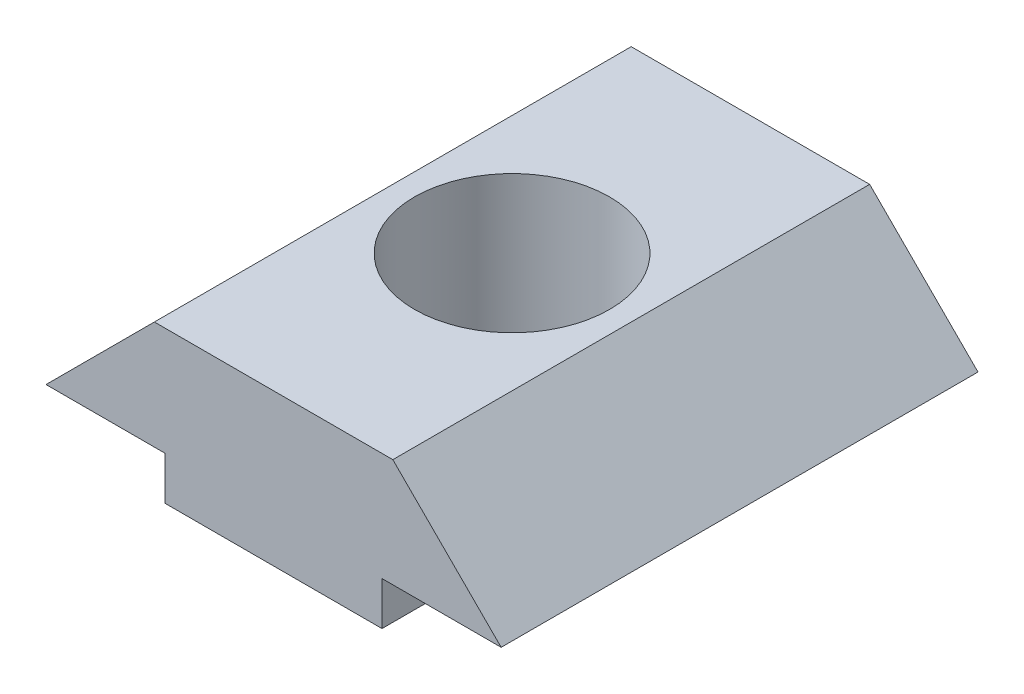
ISO-10303-21;
HEADER;
FILE_DESCRIPTION(('STEP AP214'),'2;1');
FILE_NAME('part.step','',(''),(''),'','','');
FILE_SCHEMA(('AUTOMOTIVE_DESIGN { 1 0 10303 214 1 1 1 1 }'));
ENDSEC;
DATA;
#1=APPLICATION_CONTEXT('core data for automotive mechanical design processes');
#2=APPLICATION_PROTOCOL_DEFINITION('international standard','automotive_design',2000,#1);
#3=PRODUCT_CONTEXT('',#1,'mechanical');
#4=PRODUCT('Part','Part','',(#3));
#5=PRODUCT_RELATED_PRODUCT_CATEGORY('part','',(#4));
#6=PRODUCT_DEFINITION_FORMATION('','',#4);
#7=PRODUCT_DEFINITION_CONTEXT('part definition',#1,'design');
#8=PRODUCT_DEFINITION('design','',#6,#7);
#9=PRODUCT_DEFINITION_SHAPE('','',#8);
#10=(LENGTH_UNIT() NAMED_UNIT(*) SI_UNIT(.MILLI.,.METRE.));
#11=(NAMED_UNIT(*) PLANE_ANGLE_UNIT() SI_UNIT($,.RADIAN.));
#12=(NAMED_UNIT(*) SI_UNIT($,.STERADIAN.) SOLID_ANGLE_UNIT());
#13=UNCERTAINTY_MEASURE_WITH_UNIT(LENGTH_MEASURE(1.E-05),#10,'distance_accuracy_value','');
#14=(GEOMETRIC_REPRESENTATION_CONTEXT(3) GLOBAL_UNCERTAINTY_ASSIGNED_CONTEXT((#13)) GLOBAL_UNIT_ASSIGNED_CONTEXT((#10,
#11,#12)) REPRESENTATION_CONTEXT('',''));
#15=CARTESIAN_POINT('',(0.,0.,0.));
#16=DIRECTION('',(0.,0.,1.));
#17=DIRECTION('',(1.,0.,0.));
#18=AXIS2_PLACEMENT_3D('',#15,#16,#17);
#19=CARTESIAN_POINT('',(0.,4.75,11.));
#20=DIRECTION('',(0.,-1.,0.));
#21=DIRECTION('',(0.,0.,-1.));
#22=AXIS2_PLACEMENT_3D('',#19,#20,#21);
#23=PLANE('',#22);
#24=CARTESIAN_POINT('',(0.000951887839418207,4.75,5.5));
#25=DIRECTION('',(0.,-1.,0.));
#26=DIRECTION('',(0.,0.,-1.));
#27=AXIS2_PLACEMENT_3D('',#24,#25,#26);
#28=CIRCLE('',#27,2.25);
#29=CARTESIAN_POINT('',(0.000951887839418207,4.75,3.25));
#30=VERTEX_POINT('',#29);
#31=EDGE_CURVE('E135',#30,#30,#28,.T.);
#32=ORIENTED_EDGE('',*,*,#31,.T.);
#33=EDGE_LOOP('',(#32));
#34=FACE_BOUND('',#33,.T.);
#35=DIRECTION('',(-1.,0.,0.));
#36=VECTOR('',#35,1.);
#37=CARTESIAN_POINT('',(0.,4.75,0.));
#38=LINE('',#37,#36);
#39=CARTESIAN_POINT('',(2.75095188783942,4.75,0.));
#40=VERTEX_POINT('',#39);
#41=CARTESIAN_POINT('',(-2.75,4.75,0.));
#42=VERTEX_POINT('',#41);
#43=EDGE_CURVE('E132',#40,#42,#38,.T.);
#44=ORIENTED_EDGE('',*,*,#43,.T.);
#45=DIRECTION('',(0.,0.,-1.));
#46=VECTOR('',#45,1.);
#47=CARTESIAN_POINT('',(-2.75,4.75,11.));
#48=LINE('',#47,#46);
#49=CARTESIAN_POINT('',(-2.75,4.75,11.));
#50=VERTEX_POINT('',#49);
#51=EDGE_CURVE('E11',#50,#42,#48,.T.);
#52=ORIENTED_EDGE('',*,*,#51,.F.);
#53=DIRECTION('',(-1.,0.,0.));
#54=VECTOR('',#53,1.);
#55=CARTESIAN_POINT('',(0.,4.75,11.));
#56=LINE('',#55,#54);
#57=CARTESIAN_POINT('',(2.75095188783942,4.75,11.));
#58=VERTEX_POINT('',#57);
#59=EDGE_CURVE('E153',#58,#50,#56,.T.);
#60=ORIENTED_EDGE('',*,*,#59,.F.);
#61=DIRECTION('',(0.,0.,-1.));
#62=VECTOR('',#61,1.);
#63=CARTESIAN_POINT('',(2.75095188783942,4.75,11.));
#64=LINE('',#63,#62);
#65=EDGE_CURVE('E50',#58,#40,#64,.T.);
#66=ORIENTED_EDGE('',*,*,#65,.T.);
#67=EDGE_LOOP('',(#44,#52,#60,#66));
#68=FACE_BOUND('',#67,.T.);
#69=ADVANCED_FACE('F34',(#34,#68),#23,.F.);
#70=CARTESIAN_POINT('',(-3.75,3.75,11.));
#71=DIRECTION('',(0.707106781186548,-0.707106781186548,0.));
#72=DIRECTION('',(0.707106781186548,0.707106781186548,0.));
#73=AXIS2_PLACEMENT_3D('',#70,#71,#72);
#74=PLANE('',#73);
#75=DIRECTION('',(-0.707106781186548,-0.707106781186548,0.));
#76=VECTOR('',#75,1.);
#77=CARTESIAN_POINT('',(-3.75,3.75,0.));
#78=LINE('',#77,#76);
#79=CARTESIAN_POINT('',(-5.25,2.25,0.));
#80=VERTEX_POINT('',#79);
#81=EDGE_CURVE('E134',#42,#80,#78,.T.);
#82=ORIENTED_EDGE('',*,*,#81,.T.);
#83=DIRECTION('',(0.,0.,-1.));
#84=VECTOR('',#83,1.);
#85=CARTESIAN_POINT('',(-5.25,2.25,11.));
#86=LINE('',#85,#84);
#87=CARTESIAN_POINT('',(-5.25,2.25,11.));
#88=VERTEX_POINT('',#87);
#89=EDGE_CURVE('E42',#88,#80,#86,.T.);
#90=ORIENTED_EDGE('',*,*,#89,.F.);
#91=DIRECTION('',(-0.707106781186548,-0.707106781186548,0.));
#92=VECTOR('',#91,1.);
#93=CARTESIAN_POINT('',(-3.75,3.75,11.));
#94=LINE('',#93,#92);
#95=EDGE_CURVE('E89',#50,#88,#94,.T.);
#96=ORIENTED_EDGE('',*,*,#95,.F.);
#97=ORIENTED_EDGE('',*,*,#51,.T.);
#98=EDGE_LOOP('',(#82,#90,#96,#97));
#99=FACE_BOUND('',#98,.T.);
#100=ADVANCED_FACE('F166',(#99),#74,.F.);
#101=CARTESIAN_POINT('',(0.,2.25,11.));
#102=DIRECTION('',(0.,-1.,0.));
#103=DIRECTION('',(0.,0.,-1.));
#104=AXIS2_PLACEMENT_3D('',#101,#102,#103);
#105=PLANE('',#104);
#106=DIRECTION('',(-1.,0.,0.));
#107=VECTOR('',#106,1.);
#108=CARTESIAN_POINT('',(0.,2.25,0.));
#109=LINE('',#108,#107);
#110=CARTESIAN_POINT('',(-2.5,2.25,0.));
#111=VERTEX_POINT('',#110);
#112=EDGE_CURVE('E138',#111,#80,#109,.T.);
#113=ORIENTED_EDGE('',*,*,#112,.F.);
#114=DIRECTION('',(0.,0.,-1.));
#115=VECTOR('',#114,1.);
#116=CARTESIAN_POINT('',(-2.5,2.25,11.));
#117=LINE('',#116,#115);
#118=CARTESIAN_POINT('',(-2.5,2.25,11.));
#119=VERTEX_POINT('',#118);
#120=EDGE_CURVE('E159',#119,#111,#117,.T.);
#121=ORIENTED_EDGE('',*,*,#120,.F.);
#122=DIRECTION('',(-1.,0.,0.));
#123=VECTOR('',#122,1.);
#124=CARTESIAN_POINT('',(0.,2.25,11.));
#125=LINE('',#124,#123);
#126=EDGE_CURVE('E165',#119,#88,#125,.T.);
#127=ORIENTED_EDGE('',*,*,#126,.T.);
#128=ORIENTED_EDGE('',*,*,#89,.T.);
#129=EDGE_LOOP('',(#113,#121,#127,#128));
#130=FACE_BOUND('',#129,.T.);
#131=ADVANCED_FACE('F163',(#130),#105,.T.);
#132=CARTESIAN_POINT('',(-2.5,0.,11.));
#133=DIRECTION('',(1.,0.,0.));
#134=DIRECTION('',(0.,1.,0.));
#135=AXIS2_PLACEMENT_3D('',#132,#133,#134);
#136=PLANE('',#135);
#137=DIRECTION('',(0.,-1.,0.));
#138=VECTOR('',#137,1.);
#139=CARTESIAN_POINT('',(-2.5,0.,0.));
#140=LINE('',#139,#138);
#141=CARTESIAN_POINT('',(-2.5,1.25,0.));
#142=VERTEX_POINT('',#141);
#143=EDGE_CURVE('E141',#111,#142,#140,.T.);
#144=ORIENTED_EDGE('',*,*,#143,.T.);
#145=DIRECTION('',(0.,0.,-1.));
#146=VECTOR('',#145,1.);
#147=CARTESIAN_POINT('',(-2.5,1.25,11.));
#148=LINE('',#147,#146);
#149=CARTESIAN_POINT('',(-2.5,1.25,11.));
#150=VERTEX_POINT('',#149);
#151=EDGE_CURVE('E157',#150,#142,#148,.T.);
#152=ORIENTED_EDGE('',*,*,#151,.F.);
#153=DIRECTION('',(0.,-1.,0.));
#154=VECTOR('',#153,1.);
#155=CARTESIAN_POINT('',(-2.5,0.,11.));
#156=LINE('',#155,#154);
#157=EDGE_CURVE('E127',#119,#150,#156,.T.);
#158=ORIENTED_EDGE('',*,*,#157,.F.);
#159=ORIENTED_EDGE('',*,*,#120,.T.);
#160=EDGE_LOOP('',(#144,#152,#158,#159));
#161=FACE_BOUND('',#160,.T.);
#162=ADVANCED_FACE('F174',(#161),#136,.F.);
#163=CARTESIAN_POINT('',(0.,1.25,11.));
#164=DIRECTION('',(0.,-1.,0.));
#165=DIRECTION('',(0.,0.,-1.));
#166=AXIS2_PLACEMENT_3D('',#163,#164,#165);
#167=PLANE('',#166);
#168=CARTESIAN_POINT('',(0.000951887839418207,1.25,5.5));
#169=DIRECTION('',(0.,-1.,0.));
#170=DIRECTION('',(0.,0.,-1.));
#171=AXIS2_PLACEMENT_3D('',#168,#169,#170);
#172=CIRCLE('',#171,2.25);
#173=CARTESIAN_POINT('',(0.000951887839418207,1.25,3.25));
#174=VERTEX_POINT('',#173);
#175=EDGE_CURVE('E180',#174,#174,#172,.T.);
#176=ORIENTED_EDGE('',*,*,#175,.F.);
#177=EDGE_LOOP('',(#176));
#178=FACE_BOUND('',#177,.T.);
#179=DIRECTION('',(-1.,0.,0.));
#180=VECTOR('',#179,1.);
#181=CARTESIAN_POINT('',(0.,1.25,0.));
#182=LINE('',#181,#180);
#183=CARTESIAN_POINT('',(2.50095188783942,1.25,0.));
#184=VERTEX_POINT('',#183);
#185=EDGE_CURVE('E144',#184,#142,#182,.T.);
#186=ORIENTED_EDGE('',*,*,#185,.F.);
#187=DIRECTION('',(0.,0.,-1.));
#188=VECTOR('',#187,1.);
#189=CARTESIAN_POINT('',(2.50095188783942,1.25,11.));
#190=LINE('',#189,#188);
#191=CARTESIAN_POINT('',(2.50095188783942,1.25,11.));
#192=VERTEX_POINT('',#191);
#193=EDGE_CURVE('E114',#192,#184,#190,.T.);
#194=ORIENTED_EDGE('',*,*,#193,.F.);
#195=DIRECTION('',(-1.,0.,0.));
#196=VECTOR('',#195,1.);
#197=CARTESIAN_POINT('',(0.,1.25,11.));
#198=LINE('',#197,#196);
#199=EDGE_CURVE('E125',#192,#150,#198,.T.);
#200=ORIENTED_EDGE('',*,*,#199,.T.);
#201=ORIENTED_EDGE('',*,*,#151,.T.);
#202=EDGE_LOOP('',(#186,#194,#200,#201));
#203=FACE_BOUND('',#202,.T.);
#204=ADVANCED_FACE('F193',(#178,#203),#167,.T.);
#205=CARTESIAN_POINT('',(2.50095188783942,0.,11.));
#206=DIRECTION('',(1.,0.,0.));
#207=DIRECTION('',(0.,1.,0.));
#208=AXIS2_PLACEMENT_3D('',#205,#206,#207);
#209=PLANE('',#208);
#210=DIRECTION('',(0.,-1.,0.));
#211=VECTOR('',#210,1.);
#212=CARTESIAN_POINT('',(2.50095188783942,0.,0.));
#213=LINE('',#212,#211);
#214=CARTESIAN_POINT('',(2.50095188783942,2.25,0.));
#215=VERTEX_POINT('',#214);
#216=EDGE_CURVE('E111',#215,#184,#213,.T.);
#217=ORIENTED_EDGE('',*,*,#216,.F.);
#218=DIRECTION('',(0.,0.,-1.));
#219=VECTOR('',#218,1.);
#220=CARTESIAN_POINT('',(2.50095188783942,2.25,11.));
#221=LINE('',#220,#219);
#222=CARTESIAN_POINT('',(2.50095188783942,2.25,11.));
#223=VERTEX_POINT('',#222);
#224=EDGE_CURVE('E105',#223,#215,#221,.T.);
#225=ORIENTED_EDGE('',*,*,#224,.F.);
#226=DIRECTION('',(0.,-1.,0.));
#227=VECTOR('',#226,1.);
#228=CARTESIAN_POINT('',(2.50095188783942,0.,11.));
#229=LINE('',#228,#227);
#230=EDGE_CURVE('E109',#223,#192,#229,.T.);
#231=ORIENTED_EDGE('',*,*,#230,.T.);
#232=ORIENTED_EDGE('',*,*,#193,.T.);
#233=EDGE_LOOP('',(#217,#225,#231,#232));
#234=FACE_BOUND('',#233,.T.);
#235=ADVANCED_FACE('F107',(#234),#209,.T.);
#236=CARTESIAN_POINT('',(0.,2.25,11.));
#237=DIRECTION('',(0.,1.,0.));
#238=DIRECTION('',(0.,0.,1.));
#239=AXIS2_PLACEMENT_3D('',#236,#237,#238);
#240=PLANE('',#239);
#241=DIRECTION('',(1.,0.,0.));
#242=VECTOR('',#241,1.);
#243=CARTESIAN_POINT('',(0.,2.25,0.));
#244=LINE('',#243,#242);
#245=CARTESIAN_POINT('',(5.25,2.25,0.));
#246=VERTEX_POINT('',#245);
#247=EDGE_CURVE('E148',#215,#246,#244,.T.);
#248=ORIENTED_EDGE('',*,*,#247,.T.);
#249=DIRECTION('',(0.,0.,-1.));
#250=VECTOR('',#249,1.);
#251=CARTESIAN_POINT('',(5.25,2.25,11.));
#252=LINE('',#251,#250);
#253=CARTESIAN_POINT('',(5.25,2.25,11.));
#254=VERTEX_POINT('',#253);
#255=EDGE_CURVE('E77',#254,#246,#252,.T.);
#256=ORIENTED_EDGE('',*,*,#255,.F.);
#257=DIRECTION('',(1.,0.,0.));
#258=VECTOR('',#257,1.);
#259=CARTESIAN_POINT('',(0.,2.25,11.));
#260=LINE('',#259,#258);
#261=EDGE_CURVE('E116',#223,#254,#260,.T.);
#262=ORIENTED_EDGE('',*,*,#261,.F.);
#263=ORIENTED_EDGE('',*,*,#224,.T.);
#264=EDGE_LOOP('',(#248,#256,#262,#263));
#265=FACE_BOUND('',#264,.T.);
#266=ADVANCED_FACE('F117',(#265),#240,.F.);
#267=CARTESIAN_POINT('',(3.75099959093118,3.74957137857267,11.));
#268=DIRECTION('',(0.707241411267397,0.706972125467829,0.));
#269=DIRECTION('',(-0.706972125467829,0.707241411267397,0.));
#270=AXIS2_PLACEMENT_3D('',#267,#268,#269);
#271=PLANE('',#270);
#272=DIRECTION('',(0.70697212546783,-0.707241411267397,0.));
#273=VECTOR('',#272,1.);
#274=CARTESIAN_POINT('',(3.75099959093118,3.74957137857267,0.));
#275=LINE('',#274,#273);
#276=EDGE_CURVE('E150',#40,#246,#275,.T.);
#277=ORIENTED_EDGE('',*,*,#276,.F.);
#278=ORIENTED_EDGE('',*,*,#65,.F.);
#279=DIRECTION('',(0.70697212546783,-0.707241411267397,0.));
#280=VECTOR('',#279,1.);
#281=CARTESIAN_POINT('',(3.75099959093118,3.74957137857267,11.));
#282=LINE('',#281,#280);
#283=EDGE_CURVE('E120',#58,#254,#282,.T.);
#284=ORIENTED_EDGE('',*,*,#283,.T.);
#285=ORIENTED_EDGE('',*,*,#255,.T.);
#286=EDGE_LOOP('',(#277,#278,#284,#285));
#287=FACE_BOUND('',#286,.T.);
#288=ADVANCED_FACE('F197',(#287),#271,.T.);
#289=CARTESIAN_POINT('',(0.,0.,11.));
#290=DIRECTION('',(0.,0.,1.));
#291=DIRECTION('',(1.,0.,0.));
#292=AXIS2_PLACEMENT_3D('',#289,#290,#291);
#293=PLANE('',#292);
#294=ORIENTED_EDGE('',*,*,#59,.T.);
#295=ORIENTED_EDGE('',*,*,#95,.T.);
#296=ORIENTED_EDGE('',*,*,#126,.F.);
#297=ORIENTED_EDGE('',*,*,#157,.T.);
#298=ORIENTED_EDGE('',*,*,#199,.F.);
#299=ORIENTED_EDGE('',*,*,#230,.F.);
#300=ORIENTED_EDGE('',*,*,#261,.T.);
#301=ORIENTED_EDGE('',*,*,#283,.F.);
#302=EDGE_LOOP('',(#294,#295,#296,#297,#298,#299,#300,#301));
#303=FACE_BOUND('',#302,.T.);
#304=ADVANCED_FACE('F123',(#303),#293,.T.);
#305=CARTESIAN_POINT('',(0.,0.,0.));
#306=DIRECTION('',(0.,0.,1.));
#307=DIRECTION('',(1.,0.,0.));
#308=AXIS2_PLACEMENT_3D('',#305,#306,#307);
#309=PLANE('',#308);
#310=ORIENTED_EDGE('',*,*,#43,.F.);
#311=ORIENTED_EDGE('',*,*,#276,.T.);
#312=ORIENTED_EDGE('',*,*,#247,.F.);
#313=ORIENTED_EDGE('',*,*,#216,.T.);
#314=ORIENTED_EDGE('',*,*,#185,.T.);
#315=ORIENTED_EDGE('',*,*,#143,.F.);
#316=ORIENTED_EDGE('',*,*,#112,.T.);
#317=ORIENTED_EDGE('',*,*,#81,.F.);
#318=EDGE_LOOP('',(#310,#311,#312,#313,#314,#315,#316,#317));
#319=FACE_BOUND('',#318,.T.);
#320=ADVANCED_FACE('F170',(#319),#309,.F.);
#321=CARTESIAN_POINT('',(0.000951887839418207,4.75,5.5));
#322=DIRECTION('',(0.,-1.,0.));
#323=DIRECTION('',(0.,0.,-1.));
#324=AXIS2_PLACEMENT_3D('',#321,#322,#323);
#325=CYLINDRICAL_SURFACE('',#324,2.25);
#326=ORIENTED_EDGE('',*,*,#31,.F.);
#327=EDGE_LOOP('',(#326));
#328=FACE_BOUND('',#327,.T.);
#329=ORIENTED_EDGE('',*,*,#175,.T.);
#330=EDGE_LOOP('',(#329));
#331=FACE_BOUND('',#330,.T.);
#332=ADVANCED_FACE('F187',(#328,#331),#325,.F.);
#333=CLOSED_SHELL('',(#69,#100,#131,#162,#204,#235,#266,#288,#304,#320,#332));
#334=MANIFOLD_SOLID_BREP('B2',#333);
#335=ADVANCED_BREP_SHAPE_REPRESENTATION('',(#18,#334),#14);
#336=SHAPE_DEFINITION_REPRESENTATION(#9,#335);
ENDSEC;
END-ISO-10303-21;
